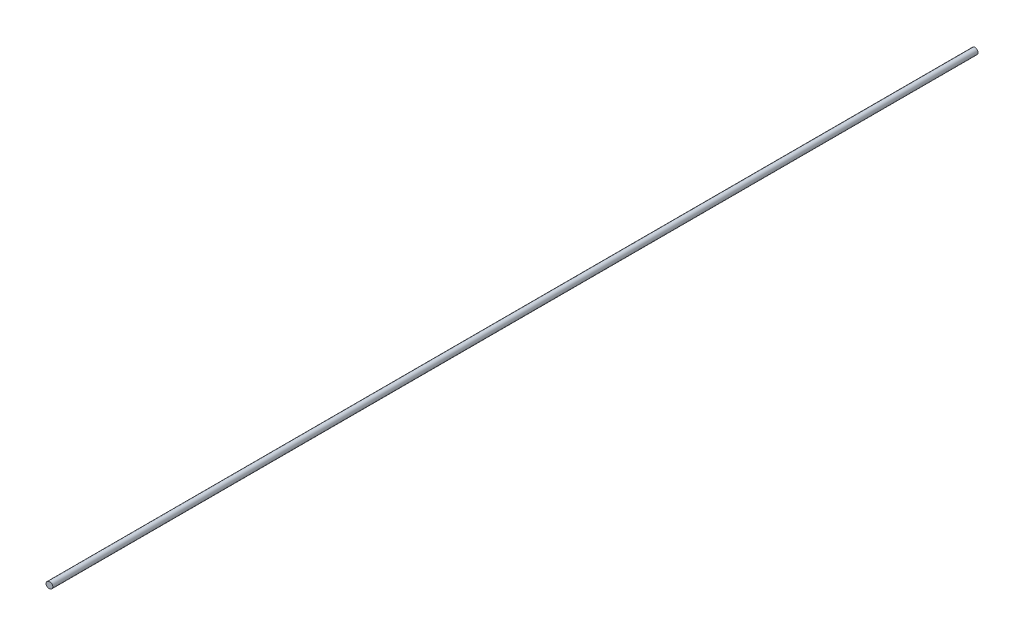
ISO-10303-21;
HEADER;
FILE_DESCRIPTION(('STEP AP214'),'2;1');
FILE_NAME('part.step','',(''),(''),'','','');
FILE_SCHEMA(('AUTOMOTIVE_DESIGN { 1 0 10303 214 1 1 1 1 }'));
ENDSEC;
DATA;
#1=APPLICATION_CONTEXT('core data for automotive mechanical design processes');
#2=APPLICATION_PROTOCOL_DEFINITION('international standard','automotive_design',2000,#1);
#3=PRODUCT_CONTEXT('',#1,'mechanical');
#4=PRODUCT('Part','Part','',(#3));
#5=PRODUCT_RELATED_PRODUCT_CATEGORY('part','',(#4));
#6=PRODUCT_DEFINITION_FORMATION('','',#4);
#7=PRODUCT_DEFINITION_CONTEXT('part definition',#1,'design');
#8=PRODUCT_DEFINITION('design','',#6,#7);
#9=PRODUCT_DEFINITION_SHAPE('','',#8);
#10=(LENGTH_UNIT() NAMED_UNIT(*) SI_UNIT(.MILLI.,.METRE.));
#11=(NAMED_UNIT(*) PLANE_ANGLE_UNIT() SI_UNIT($,.RADIAN.));
#12=(NAMED_UNIT(*) SI_UNIT($,.STERADIAN.) SOLID_ANGLE_UNIT());
#13=UNCERTAINTY_MEASURE_WITH_UNIT(LENGTH_MEASURE(1.E-05),#10,'distance_accuracy_value','');
#14=(GEOMETRIC_REPRESENTATION_CONTEXT(3) GLOBAL_UNCERTAINTY_ASSIGNED_CONTEXT((#13)) GLOBAL_UNIT_ASSIGNED_CONTEXT((#10,
#11,#12)) REPRESENTATION_CONTEXT('',''));
#15=CARTESIAN_POINT('',(0.,0.,0.));
#16=DIRECTION('',(0.,0.,1.));
#17=DIRECTION('',(1.,0.,0.));
#18=AXIS2_PLACEMENT_3D('',#15,#16,#17);
#19=CARTESIAN_POINT('',(0.,0.,450.));
#20=DIRECTION('',(0.,0.,-1.));
#21=DIRECTION('',(-1.,0.,0.));
#22=AXIS2_PLACEMENT_3D('',#19,#20,#21);
#23=CYLINDRICAL_SURFACE('',#22,1.5);
#24=CARTESIAN_POINT('',(0.,0.,0.));
#25=DIRECTION('',(0.,0.,1.));
#26=DIRECTION('',(1.,0.,0.));
#27=AXIS2_PLACEMENT_3D('',#24,#25,#26);
#28=CIRCLE('',#27,1.5);
#29=CARTESIAN_POINT('',(1.5,0.,0.));
#30=VERTEX_POINT('',#29);
#31=EDGE_CURVE('E10',#30,#30,#28,.T.);
#32=ORIENTED_EDGE('',*,*,#31,.T.);
#33=EDGE_LOOP('',(#32));
#34=FACE_BOUND('',#33,.T.);
#35=CARTESIAN_POINT('',(0.,0.,449.838107329351));
#36=DIRECTION('',(-0.107305281140308,0.,-0.994226119471521));
#37=DIRECTION('',(0.994226119471521,0.,-0.107305281140308));
#38=AXIS2_PLACEMENT_3D('',#35,#36,#37);
#39=ELLIPSE('',#38,1.50871111774585,1.5);
#40=CARTESIAN_POINT('',(1.5,0.,449.676214658702));
#41=VERTEX_POINT('',#40);
#42=EDGE_CURVE('E49',#41,#41,#39,.T.);
#43=ORIENTED_EDGE('',*,*,#42,.T.);
#44=EDGE_LOOP('',(#43));
#45=FACE_BOUND('',#44,.T.);
#46=ADVANCED_FACE('F42',(#34,#45),#23,.T.);
#47=CARTESIAN_POINT('',(0.,0.,0.));
#48=DIRECTION('',(0.,0.,1.));
#49=DIRECTION('',(1.,0.,0.));
#50=AXIS2_PLACEMENT_3D('',#47,#48,#49);
#51=PLANE('',#50);
#52=ORIENTED_EDGE('',*,*,#31,.F.);
#53=EDGE_LOOP('',(#52));
#54=FACE_BOUND('',#53,.T.);
#55=ADVANCED_FACE('F59',(#54),#51,.F.);
#56=CARTESIAN_POINT('',(-1.5,-1.5,450.));
#57=DIRECTION('',(-0.107305281140308,0.,-0.994226119471521));
#58=DIRECTION('',(-0.994226119471521,0.,0.107305281140308));
#59=AXIS2_PLACEMENT_3D('',#56,#57,#58);
#60=PLANE('',#59);
#61=ORIENTED_EDGE('',*,*,#42,.F.);
#62=EDGE_LOOP('',(#61));
#63=FACE_BOUND('',#62,.T.);
#64=ADVANCED_FACE('F57',(#63),#60,.F.);
#65=CLOSED_SHELL('',(#46,#55,#64));
#66=MANIFOLD_SOLID_BREP('B2',#65);
#67=ADVANCED_BREP_SHAPE_REPRESENTATION('',(#18,#66),#14);
#68=SHAPE_DEFINITION_REPRESENTATION(#9,#67);
ENDSEC;
END-ISO-10303-21;
